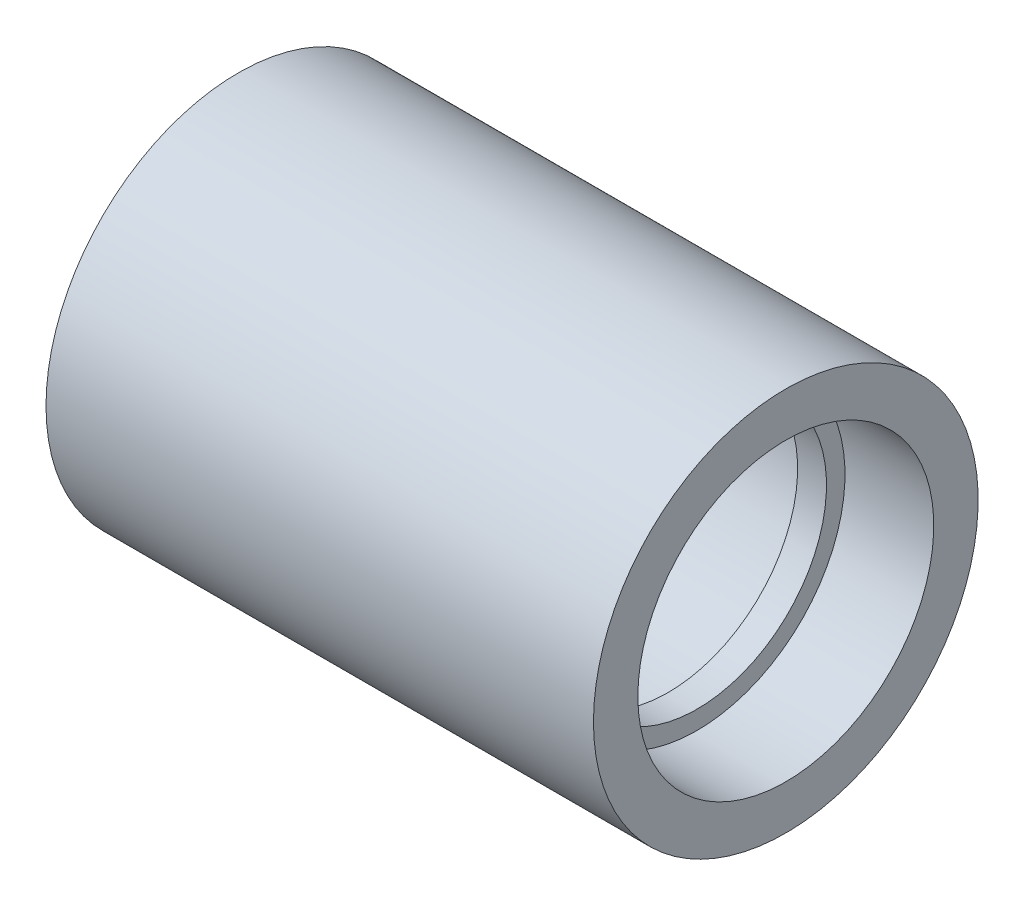
ISO-10303-21;
HEADER;
FILE_DESCRIPTION(('STEP AP214'),'2;1');
FILE_NAME('part.step','',(''),(''),'','','');
FILE_SCHEMA(('AUTOMOTIVE_DESIGN { 1 0 10303 214 1 1 1 1 }'));
ENDSEC;
DATA;
#1=APPLICATION_CONTEXT('core data for automotive mechanical design processes');
#2=APPLICATION_PROTOCOL_DEFINITION('international standard','automotive_design',2000,#1);
#3=PRODUCT_CONTEXT('',#1,'mechanical');
#4=PRODUCT('Part','Part','',(#3));
#5=PRODUCT_RELATED_PRODUCT_CATEGORY('part','',(#4));
#6=PRODUCT_DEFINITION_FORMATION('','',#4);
#7=PRODUCT_DEFINITION_CONTEXT('part definition',#1,'design');
#8=PRODUCT_DEFINITION('design','',#6,#7);
#9=PRODUCT_DEFINITION_SHAPE('','',#8);
#10=(LENGTH_UNIT() NAMED_UNIT(*) SI_UNIT(.MILLI.,.METRE.));
#11=(NAMED_UNIT(*) PLANE_ANGLE_UNIT() SI_UNIT($,.RADIAN.));
#12=(NAMED_UNIT(*) SI_UNIT($,.STERADIAN.) SOLID_ANGLE_UNIT());
#13=UNCERTAINTY_MEASURE_WITH_UNIT(LENGTH_MEASURE(1.E-05),#10,'distance_accuracy_value','');
#14=(GEOMETRIC_REPRESENTATION_CONTEXT(3) GLOBAL_UNCERTAINTY_ASSIGNED_CONTEXT((#13)) GLOBAL_UNIT_ASSIGNED_CONTEXT((#10,
#11,#12)) REPRESENTATION_CONTEXT('',''));
#15=CARTESIAN_POINT('',(0.,0.,0.));
#16=DIRECTION('',(0.,0.,1.));
#17=DIRECTION('',(1.,0.,0.));
#18=AXIS2_PLACEMENT_3D('',#15,#16,#17);
#19=CARTESIAN_POINT('',(0.,0.,0.));
#20=DIRECTION('',(-1.,0.,0.));
#21=DIRECTION('',(0.,0.,1.));
#22=AXIS2_PLACEMENT_3D('',#19,#20,#21);
#23=CYLINDRICAL_SURFACE('',#22,26.);
#24=CARTESIAN_POINT('',(-1.66255901794145,0.,0.));
#25=DIRECTION('',(-1.,0.,0.));
#26=DIRECTION('',(0.,0.,1.));
#27=AXIS2_PLACEMENT_3D('',#24,#25,#26);
#28=CIRCLE('',#27,26.);
#29=CARTESIAN_POINT('',(-1.66255901794145,0.,26.));
#30=VERTEX_POINT('',#29);
#31=EDGE_CURVE('E86',#30,#30,#28,.T.);
#32=ORIENTED_EDGE('',*,*,#31,.F.);
#33=EDGE_LOOP('',(#32));
#34=FACE_BOUND('',#33,.T.);
#35=CARTESIAN_POINT('',(72.3374409820586,0.,0.));
#36=DIRECTION('',(-1.,0.,0.));
#37=DIRECTION('',(0.,0.,1.));
#38=AXIS2_PLACEMENT_3D('',#35,#36,#37);
#39=CIRCLE('',#38,26.);
#40=CARTESIAN_POINT('',(72.3374409820586,0.,26.));
#41=VERTEX_POINT('',#40);
#42=EDGE_CURVE('E10',#41,#41,#39,.T.);
#43=ORIENTED_EDGE('',*,*,#42,.T.);
#44=EDGE_LOOP('',(#43));
#45=FACE_BOUND('',#44,.T.);
#46=ADVANCED_FACE('F43',(#34,#45),#23,.T.);
#47=CARTESIAN_POINT('',(72.3374409820586,26.,0.));
#48=DIRECTION('',(-1.,0.,0.));
#49=DIRECTION('',(0.,0.,1.));
#50=AXIS2_PLACEMENT_3D('',#47,#48,#49);
#51=PLANE('',#50);
#52=ORIENTED_EDGE('',*,*,#42,.F.);
#53=EDGE_LOOP('',(#52));
#54=FACE_BOUND('',#53,.T.);
#55=CARTESIAN_POINT('',(72.3374409820586,0.,0.));
#56=DIRECTION('',(-1.,0.,0.));
#57=DIRECTION('',(0.,0.,1.));
#58=AXIS2_PLACEMENT_3D('',#55,#56,#57);
#59=CIRCLE('',#58,20.);
#60=CARTESIAN_POINT('',(72.3374409820586,0.,20.));
#61=VERTEX_POINT('',#60);
#62=EDGE_CURVE('E50',#61,#61,#59,.T.);
#63=ORIENTED_EDGE('',*,*,#62,.T.);
#64=EDGE_LOOP('',(#63));
#65=FACE_BOUND('',#64,.T.);
#66=ADVANCED_FACE('F94',(#54,#65),#51,.F.);
#67=CARTESIAN_POINT('',(0.,0.,0.));
#68=DIRECTION('',(-1.,0.,0.));
#69=DIRECTION('',(0.,0.,1.));
#70=AXIS2_PLACEMENT_3D('',#67,#68,#69);
#71=CYLINDRICAL_SURFACE('',#70,20.);
#72=ORIENTED_EDGE('',*,*,#62,.F.);
#73=EDGE_LOOP('',(#72));
#74=FACE_BOUND('',#73,.T.);
#75=CARTESIAN_POINT('',(60.3374409820586,0.,0.));
#76=DIRECTION('',(-1.,0.,0.));
#77=DIRECTION('',(0.,0.,1.));
#78=AXIS2_PLACEMENT_3D('',#75,#76,#77);
#79=CIRCLE('',#78,20.);
#80=CARTESIAN_POINT('',(60.3374409820586,0.,20.));
#81=VERTEX_POINT('',#80);
#82=EDGE_CURVE('E55',#81,#81,#79,.T.);
#83=ORIENTED_EDGE('',*,*,#82,.T.);
#84=EDGE_LOOP('',(#83));
#85=FACE_BOUND('',#84,.T.);
#86=ADVANCED_FACE('F98',(#74,#85),#71,.F.);
#87=CARTESIAN_POINT('',(60.3374409820586,20.,0.));
#88=DIRECTION('',(-1.,0.,0.));
#89=DIRECTION('',(0.,0.,1.));
#90=AXIS2_PLACEMENT_3D('',#87,#88,#89);
#91=PLANE('',#90);
#92=ORIENTED_EDGE('',*,*,#82,.F.);
#93=EDGE_LOOP('',(#92));
#94=FACE_BOUND('',#93,.T.);
#95=CARTESIAN_POINT('',(60.3374409820586,0.,0.));
#96=DIRECTION('',(-1.,0.,0.));
#97=DIRECTION('',(0.,0.,1.));
#98=AXIS2_PLACEMENT_3D('',#95,#96,#97);
#99=CIRCLE('',#98,17.5);
#100=CARTESIAN_POINT('',(60.3374409820586,0.,17.5));
#101=VERTEX_POINT('',#100);
#102=EDGE_CURVE('E60',#101,#101,#99,.T.);
#103=ORIENTED_EDGE('',*,*,#102,.T.);
#104=EDGE_LOOP('',(#103));
#105=FACE_BOUND('',#104,.T.);
#106=ADVANCED_FACE('F103',(#94,#105),#91,.F.);
#107=CARTESIAN_POINT('',(0.,0.,0.));
#108=DIRECTION('',(-1.,0.,0.));
#109=DIRECTION('',(0.,0.,1.));
#110=AXIS2_PLACEMENT_3D('',#107,#108,#109);
#111=CYLINDRICAL_SURFACE('',#110,17.5);
#112=ORIENTED_EDGE('',*,*,#102,.F.);
#113=EDGE_LOOP('',(#112));
#114=FACE_BOUND('',#113,.T.);
#115=CARTESIAN_POINT('',(56.4374409820586,0.,0.));
#116=DIRECTION('',(-1.,0.,0.));
#117=DIRECTION('',(0.,0.,1.));
#118=AXIS2_PLACEMENT_3D('',#115,#116,#117);
#119=CIRCLE('',#118,17.5);
#120=CARTESIAN_POINT('',(56.4374409820586,0.,17.5));
#121=VERTEX_POINT('',#120);
#122=EDGE_CURVE('E66',#121,#121,#119,.T.);
#123=ORIENTED_EDGE('',*,*,#122,.T.);
#124=EDGE_LOOP('',(#123));
#125=FACE_BOUND('',#124,.T.);
#126=ADVANCED_FACE('F109',(#114,#125),#111,.F.);
#127=CARTESIAN_POINT('',(56.4374409820586,17.5,0.));
#128=DIRECTION('',(1.,0.,0.));
#129=DIRECTION('',(0.,0.,-1.));
#130=AXIS2_PLACEMENT_3D('',#127,#128,#129);
#131=PLANE('',#130);
#132=ORIENTED_EDGE('',*,*,#122,.F.);
#133=EDGE_LOOP('',(#132));
#134=FACE_BOUND('',#133,.T.);
#135=CARTESIAN_POINT('',(56.4374409820586,0.,0.));
#136=DIRECTION('',(-1.,0.,0.));
#137=DIRECTION('',(0.,0.,1.));
#138=AXIS2_PLACEMENT_3D('',#135,#136,#137);
#139=CIRCLE('',#138,22.);
#140=CARTESIAN_POINT('',(56.4374409820586,0.,22.));
#141=VERTEX_POINT('',#140);
#142=EDGE_CURVE('E70',#141,#141,#139,.T.);
#143=ORIENTED_EDGE('',*,*,#142,.T.);
#144=EDGE_LOOP('',(#143));
#145=FACE_BOUND('',#144,.T.);
#146=ADVANCED_FACE('F113',(#134,#145),#131,.F.);
#147=CARTESIAN_POINT('',(0.,0.,0.));
#148=DIRECTION('',(-1.,0.,0.));
#149=DIRECTION('',(0.,0.,1.));
#150=AXIS2_PLACEMENT_3D('',#147,#148,#149);
#151=CYLINDRICAL_SURFACE('',#150,22.);
#152=ORIENTED_EDGE('',*,*,#142,.F.);
#153=EDGE_LOOP('',(#152));
#154=FACE_BOUND('',#153,.T.);
#155=CARTESIAN_POINT('',(12.3374409820586,0.,0.));
#156=DIRECTION('',(-1.,0.,0.));
#157=DIRECTION('',(0.,0.,1.));
#158=AXIS2_PLACEMENT_3D('',#155,#156,#157);
#159=CIRCLE('',#158,22.);
#160=CARTESIAN_POINT('',(12.3374409820586,0.,22.));
#161=VERTEX_POINT('',#160);
#162=EDGE_CURVE('E74',#161,#161,#159,.T.);
#163=ORIENTED_EDGE('',*,*,#162,.T.);
#164=EDGE_LOOP('',(#163));
#165=FACE_BOUND('',#164,.T.);
#166=ADVANCED_FACE('F117',(#154,#165),#151,.F.);
#167=CARTESIAN_POINT('',(12.3374409820586,22.,0.));
#168=DIRECTION('',(1.,0.,0.));
#169=DIRECTION('',(0.,0.,-1.));
#170=AXIS2_PLACEMENT_3D('',#167,#168,#169);
#171=PLANE('',#170);
#172=ORIENTED_EDGE('',*,*,#162,.F.);
#173=EDGE_LOOP('',(#172));
#174=FACE_BOUND('',#173,.T.);
#175=CARTESIAN_POINT('',(12.3374409820586,0.,0.));
#176=DIRECTION('',(-1.,0.,0.));
#177=DIRECTION('',(0.,0.,1.));
#178=AXIS2_PLACEMENT_3D('',#175,#176,#177);
#179=CIRCLE('',#178,23.5);
#180=CARTESIAN_POINT('',(12.3374409820586,0.,23.5));
#181=VERTEX_POINT('',#180);
#182=EDGE_CURVE('E78',#181,#181,#179,.T.);
#183=ORIENTED_EDGE('',*,*,#182,.T.);
#184=EDGE_LOOP('',(#183));
#185=FACE_BOUND('',#184,.T.);
#186=ADVANCED_FACE('F121',(#174,#185),#171,.F.);
#187=CARTESIAN_POINT('',(0.,0.,0.));
#188=DIRECTION('',(-1.,0.,0.));
#189=DIRECTION('',(0.,0.,1.));
#190=AXIS2_PLACEMENT_3D('',#187,#188,#189);
#191=CYLINDRICAL_SURFACE('',#190,23.5);
#192=ORIENTED_EDGE('',*,*,#182,.F.);
#193=EDGE_LOOP('',(#192));
#194=FACE_BOUND('',#193,.T.);
#195=CARTESIAN_POINT('',(-1.66255901794145,0.,0.));
#196=DIRECTION('',(-1.,0.,0.));
#197=DIRECTION('',(0.,0.,1.));
#198=AXIS2_PLACEMENT_3D('',#195,#196,#197);
#199=CIRCLE('',#198,23.5);
#200=CARTESIAN_POINT('',(-1.66255901794145,0.,23.5));
#201=VERTEX_POINT('',#200);
#202=EDGE_CURVE('E82',#201,#201,#199,.T.);
#203=ORIENTED_EDGE('',*,*,#202,.T.);
#204=EDGE_LOOP('',(#203));
#205=FACE_BOUND('',#204,.T.);
#206=ADVANCED_FACE('F125',(#194,#205),#191,.F.);
#207=CARTESIAN_POINT('',(-1.66255901794145,23.5,0.));
#208=DIRECTION('',(1.,0.,0.));
#209=DIRECTION('',(0.,0.,-1.));
#210=AXIS2_PLACEMENT_3D('',#207,#208,#209);
#211=PLANE('',#210);
#212=ORIENTED_EDGE('',*,*,#202,.F.);
#213=EDGE_LOOP('',(#212));
#214=FACE_BOUND('',#213,.T.);
#215=ORIENTED_EDGE('',*,*,#31,.T.);
#216=EDGE_LOOP('',(#215));
#217=FACE_BOUND('',#216,.T.);
#218=ADVANCED_FACE('F91',(#214,#217),#211,.F.);
#219=CLOSED_SHELL('',(#46,#66,#86,#106,#126,#146,#166,#186,#206,#218));
#220=MANIFOLD_SOLID_BREP('B2',#219);
#221=ADVANCED_BREP_SHAPE_REPRESENTATION('',(#18,#220),#14);
#222=SHAPE_DEFINITION_REPRESENTATION(#9,#221);
ENDSEC;
END-ISO-10303-21;
